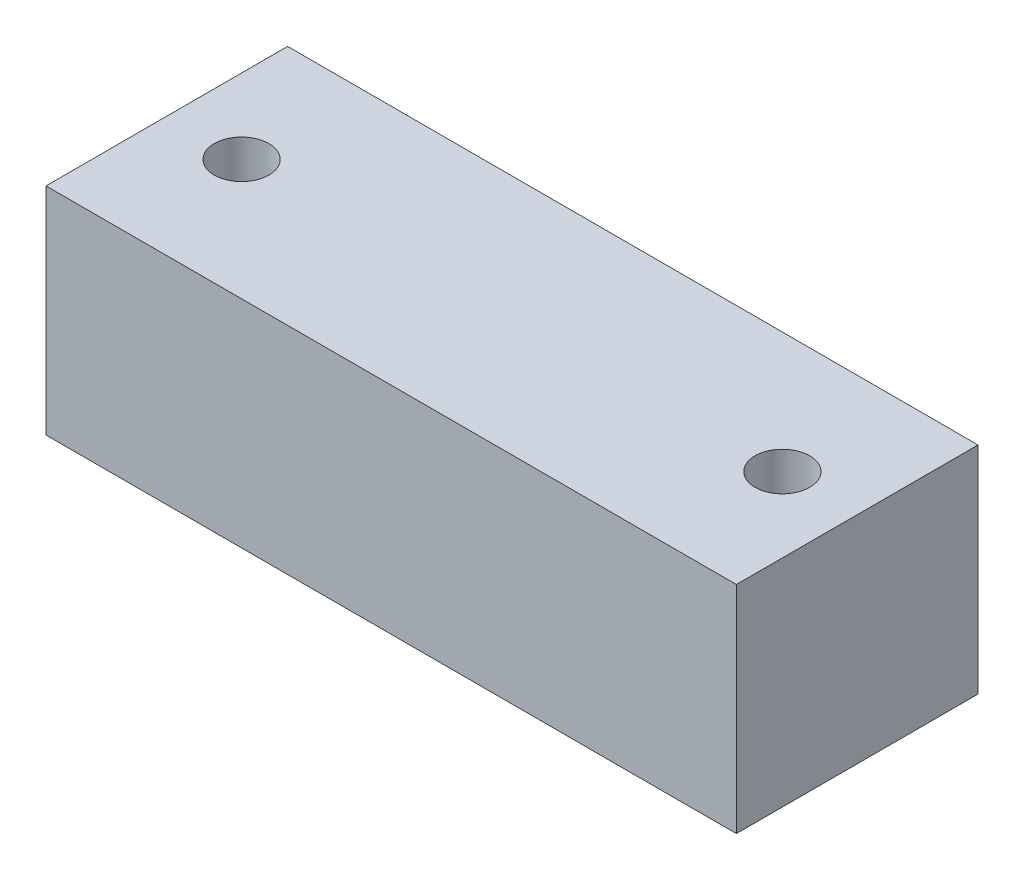
ISO-10303-21;
HEADER;
FILE_DESCRIPTION(('STEP AP214'),'2;1');
FILE_NAME('part.step','',(''),(''),'','','');
FILE_SCHEMA(('AUTOMOTIVE_DESIGN { 1 0 10303 214 1 1 1 1 }'));
ENDSEC;
DATA;
#1=APPLICATION_CONTEXT('core data for automotive mechanical design processes');
#2=APPLICATION_PROTOCOL_DEFINITION('international standard','automotive_design',2000,#1);
#3=PRODUCT_CONTEXT('',#1,'mechanical');
#4=PRODUCT('Part','Part','',(#3));
#5=PRODUCT_RELATED_PRODUCT_CATEGORY('part','',(#4));
#6=PRODUCT_DEFINITION_FORMATION('','',#4);
#7=PRODUCT_DEFINITION_CONTEXT('part definition',#1,'design');
#8=PRODUCT_DEFINITION('design','',#6,#7);
#9=PRODUCT_DEFINITION_SHAPE('','',#8);
#10=(LENGTH_UNIT() NAMED_UNIT(*) SI_UNIT(.MILLI.,.METRE.));
#11=(NAMED_UNIT(*) PLANE_ANGLE_UNIT() SI_UNIT($,.RADIAN.));
#12=(NAMED_UNIT(*) SI_UNIT($,.STERADIAN.) SOLID_ANGLE_UNIT());
#13=UNCERTAINTY_MEASURE_WITH_UNIT(LENGTH_MEASURE(1.E-05),#10,'distance_accuracy_value','');
#14=(GEOMETRIC_REPRESENTATION_CONTEXT(3) GLOBAL_UNCERTAINTY_ASSIGNED_CONTEXT((#13)) GLOBAL_UNIT_ASSIGNED_CONTEXT((#10,
#11,#12)) REPRESENTATION_CONTEXT('',''));
#15=CARTESIAN_POINT('',(0.,0.,0.));
#16=DIRECTION('',(0.,0.,1.));
#17=DIRECTION('',(1.,0.,0.));
#18=AXIS2_PLACEMENT_3D('',#15,#16,#17);
#19=CARTESIAN_POINT('',(0.,15.,0.));
#20=DIRECTION('',(0.,1.,0.));
#21=DIRECTION('',(0.,0.,1.));
#22=AXIS2_PLACEMENT_3D('',#19,#20,#21);
#23=PLANE('',#22);
#24=CARTESIAN_POINT('',(-18.8,15.,0.));
#25=DIRECTION('',(0.,1.,0.));
#26=DIRECTION('',(0.,0.,1.));
#27=AXIS2_PLACEMENT_3D('',#24,#25,#26);
#28=CIRCLE('',#27,1.9);
#29=CARTESIAN_POINT('',(-18.8,15.,1.9));
#30=VERTEX_POINT('',#29);
#31=EDGE_CURVE('E100',#30,#30,#28,.T.);
#32=ORIENTED_EDGE('',*,*,#31,.F.);
#33=EDGE_LOOP('',(#32));
#34=FACE_BOUND('',#33,.T.);
#35=DIRECTION('',(0.,0.,1.));
#36=VECTOR('',#35,1.);
#37=CARTESIAN_POINT('',(-24.,15.,8.40000000000001));
#38=LINE('',#37,#36);
#39=CARTESIAN_POINT('',(-24.,15.,-8.4));
#40=VERTEX_POINT('',#39);
#41=CARTESIAN_POINT('',(-24.,15.,8.40000000000001));
#42=VERTEX_POINT('',#41);
#43=EDGE_CURVE('E85',#40,#42,#38,.T.);
#44=ORIENTED_EDGE('',*,*,#43,.T.);
#45=DIRECTION('',(1.,0.,0.));
#46=VECTOR('',#45,1.);
#47=CARTESIAN_POINT('',(24.,15.,8.4));
#48=LINE('',#47,#46);
#49=CARTESIAN_POINT('',(24.,15.,8.4));
#50=VERTEX_POINT('',#49);
#51=EDGE_CURVE('E80',#42,#50,#48,.T.);
#52=ORIENTED_EDGE('',*,*,#51,.T.);
#53=DIRECTION('',(0.,0.,-1.));
#54=VECTOR('',#53,1.);
#55=CARTESIAN_POINT('',(24.,15.,8.4));
#56=LINE('',#55,#54);
#57=CARTESIAN_POINT('',(24.,15.,-8.4));
#58=VERTEX_POINT('',#57);
#59=EDGE_CURVE('E83',#50,#58,#56,.T.);
#60=ORIENTED_EDGE('',*,*,#59,.T.);
#61=DIRECTION('',(-1.,0.,0.));
#62=VECTOR('',#61,1.);
#63=CARTESIAN_POINT('',(24.,15.,-8.4));
#64=LINE('',#63,#62);
#65=EDGE_CURVE('E50',#58,#40,#64,.T.);
#66=ORIENTED_EDGE('',*,*,#65,.T.);
#67=EDGE_LOOP('',(#44,#52,#60,#66));
#68=FACE_BOUND('',#67,.T.);
#69=CARTESIAN_POINT('',(18.8,15.,0.));
#70=DIRECTION('',(0.,1.,0.));
#71=DIRECTION('',(0.,0.,1.));
#72=AXIS2_PLACEMENT_3D('',#69,#70,#71);
#73=CIRCLE('',#72,1.9);
#74=CARTESIAN_POINT('',(18.8,15.,1.9));
#75=VERTEX_POINT('',#74);
#76=EDGE_CURVE('E115',#75,#75,#73,.T.);
#77=ORIENTED_EDGE('',*,*,#76,.F.);
#78=EDGE_LOOP('',(#77));
#79=FACE_BOUND('',#78,.T.);
#80=ADVANCED_FACE('F33',(#34,#68,#79),#23,.T.);
#81=CARTESIAN_POINT('',(0.,0.,0.));
#82=DIRECTION('',(0.,1.,0.));
#83=DIRECTION('',(0.,0.,1.));
#84=AXIS2_PLACEMENT_3D('',#81,#82,#83);
#85=PLANE('',#84);
#86=CARTESIAN_POINT('',(-18.8,0.,0.));
#87=DIRECTION('',(0.,1.,0.));
#88=DIRECTION('',(0.,0.,1.));
#89=AXIS2_PLACEMENT_3D('',#86,#87,#88);
#90=CIRCLE('',#89,1.9);
#91=CARTESIAN_POINT('',(-18.8,0.,1.9));
#92=VERTEX_POINT('',#91);
#93=EDGE_CURVE('E112',#92,#92,#90,.T.);
#94=ORIENTED_EDGE('',*,*,#93,.T.);
#95=EDGE_LOOP('',(#94));
#96=FACE_BOUND('',#95,.T.);
#97=DIRECTION('',(0.,0.,1.));
#98=VECTOR('',#97,1.);
#99=CARTESIAN_POINT('',(-24.,0.,8.40000000000001));
#100=LINE('',#99,#98);
#101=CARTESIAN_POINT('',(-24.,0.,-8.4));
#102=VERTEX_POINT('',#101);
#103=CARTESIAN_POINT('',(-24.,0.,8.40000000000001));
#104=VERTEX_POINT('',#103);
#105=EDGE_CURVE('E97',#102,#104,#100,.T.);
#106=ORIENTED_EDGE('',*,*,#105,.F.);
#107=DIRECTION('',(-1.,0.,0.));
#108=VECTOR('',#107,1.);
#109=CARTESIAN_POINT('',(24.,0.,-8.4));
#110=LINE('',#109,#108);
#111=CARTESIAN_POINT('',(24.,0.,-8.4));
#112=VERTEX_POINT('',#111);
#113=EDGE_CURVE('E73',#112,#102,#110,.T.);
#114=ORIENTED_EDGE('',*,*,#113,.F.);
#115=DIRECTION('',(0.,0.,-1.));
#116=VECTOR('',#115,1.);
#117=CARTESIAN_POINT('',(24.,0.,8.4));
#118=LINE('',#117,#116);
#119=CARTESIAN_POINT('',(24.,0.,8.4));
#120=VERTEX_POINT('',#119);
#121=EDGE_CURVE('E67',#120,#112,#118,.T.);
#122=ORIENTED_EDGE('',*,*,#121,.F.);
#123=DIRECTION('',(1.,0.,0.));
#124=VECTOR('',#123,1.);
#125=CARTESIAN_POINT('',(24.,0.,8.4));
#126=LINE('',#125,#124);
#127=EDGE_CURVE('E89',#104,#120,#126,.T.);
#128=ORIENTED_EDGE('',*,*,#127,.F.);
#129=EDGE_LOOP('',(#106,#114,#122,#128));
#130=FACE_BOUND('',#129,.T.);
#131=CARTESIAN_POINT('',(18.8,0.,0.));
#132=DIRECTION('',(0.,1.,0.));
#133=DIRECTION('',(0.,0.,1.));
#134=AXIS2_PLACEMENT_3D('',#131,#132,#133);
#135=CIRCLE('',#134,1.9);
#136=CARTESIAN_POINT('',(18.8,0.,1.9));
#137=VERTEX_POINT('',#136);
#138=EDGE_CURVE('E118',#137,#137,#135,.T.);
#139=ORIENTED_EDGE('',*,*,#138,.T.);
#140=EDGE_LOOP('',(#139));
#141=FACE_BOUND('',#140,.T.);
#142=ADVANCED_FACE('F108',(#96,#130,#141),#85,.F.);
#143=CARTESIAN_POINT('',(-24.,15.,8.40000000000001));
#144=DIRECTION('',(1.,0.,0.));
#145=DIRECTION('',(0.,0.,-1.));
#146=AXIS2_PLACEMENT_3D('',#143,#144,#145);
#147=PLANE('',#146);
#148=ORIENTED_EDGE('',*,*,#105,.T.);
#149=DIRECTION('',(0.,-1.,0.));
#150=VECTOR('',#149,1.);
#151=CARTESIAN_POINT('',(-24.,15.,8.40000000000001));
#152=LINE('',#151,#150);
#153=EDGE_CURVE('E11',#42,#104,#152,.T.);
#154=ORIENTED_EDGE('',*,*,#153,.F.);
#155=ORIENTED_EDGE('',*,*,#43,.F.);
#156=DIRECTION('',(0.,-1.,0.));
#157=VECTOR('',#156,1.);
#158=CARTESIAN_POINT('',(-24.,15.,-8.4));
#159=LINE('',#158,#157);
#160=EDGE_CURVE('E93',#40,#102,#159,.T.);
#161=ORIENTED_EDGE('',*,*,#160,.T.);
#162=EDGE_LOOP('',(#148,#154,#155,#161));
#163=FACE_BOUND('',#162,.T.);
#164=ADVANCED_FACE('F35',(#163),#147,.F.);
#165=CARTESIAN_POINT('',(24.,15.,8.4));
#166=DIRECTION('',(0.,0.,-1.));
#167=DIRECTION('',(-1.,0.,0.));
#168=AXIS2_PLACEMENT_3D('',#165,#166,#167);
#169=PLANE('',#168);
#170=ORIENTED_EDGE('',*,*,#127,.T.);
#171=DIRECTION('',(0.,-1.,0.));
#172=VECTOR('',#171,1.);
#173=CARTESIAN_POINT('',(24.,15.,8.4));
#174=LINE('',#173,#172);
#175=EDGE_CURVE('E42',#50,#120,#174,.T.);
#176=ORIENTED_EDGE('',*,*,#175,.F.);
#177=ORIENTED_EDGE('',*,*,#51,.F.);
#178=ORIENTED_EDGE('',*,*,#153,.T.);
#179=EDGE_LOOP('',(#170,#176,#177,#178));
#180=FACE_BOUND('',#179,.T.);
#181=ADVANCED_FACE('F88',(#180),#169,.F.);
#182=CARTESIAN_POINT('',(24.,15.,8.4));
#183=DIRECTION('',(-1.,0.,0.));
#184=DIRECTION('',(0.,0.,1.));
#185=AXIS2_PLACEMENT_3D('',#182,#183,#184);
#186=PLANE('',#185);
#187=ORIENTED_EDGE('',*,*,#121,.T.);
#188=DIRECTION('',(0.,-1.,0.));
#189=VECTOR('',#188,1.);
#190=CARTESIAN_POINT('',(24.,15.,-8.4));
#191=LINE('',#190,#189);
#192=EDGE_CURVE('E90',#58,#112,#191,.T.);
#193=ORIENTED_EDGE('',*,*,#192,.F.);
#194=ORIENTED_EDGE('',*,*,#59,.F.);
#195=ORIENTED_EDGE('',*,*,#175,.T.);
#196=EDGE_LOOP('',(#187,#193,#194,#195));
#197=FACE_BOUND('',#196,.T.);
#198=ADVANCED_FACE('F91',(#197),#186,.F.);
#199=CARTESIAN_POINT('',(24.,15.,-8.4));
#200=DIRECTION('',(0.,0.,1.));
#201=DIRECTION('',(1.,0.,0.));
#202=AXIS2_PLACEMENT_3D('',#199,#200,#201);
#203=PLANE('',#202);
#204=ORIENTED_EDGE('',*,*,#113,.T.);
#205=ORIENTED_EDGE('',*,*,#160,.F.);
#206=ORIENTED_EDGE('',*,*,#65,.F.);
#207=ORIENTED_EDGE('',*,*,#192,.T.);
#208=EDGE_LOOP('',(#204,#205,#206,#207));
#209=FACE_BOUND('',#208,.T.);
#210=ADVANCED_FACE('F105',(#209),#203,.F.);
#211=CARTESIAN_POINT('',(-18.8,15.,0.));
#212=DIRECTION('',(0.,-1.,0.));
#213=DIRECTION('',(0.,0.,-1.));
#214=AXIS2_PLACEMENT_3D('',#211,#212,#213);
#215=CYLINDRICAL_SURFACE('',#214,1.9);
#216=ORIENTED_EDGE('',*,*,#31,.T.);
#217=EDGE_LOOP('',(#216));
#218=FACE_BOUND('',#217,.T.);
#219=ORIENTED_EDGE('',*,*,#93,.F.);
#220=EDGE_LOOP('',(#219));
#221=FACE_BOUND('',#220,.T.);
#222=ADVANCED_FACE('F136',(#218,#221),#215,.F.);
#223=CARTESIAN_POINT('',(18.8,15.,0.));
#224=DIRECTION('',(0.,-1.,0.));
#225=DIRECTION('',(0.,0.,-1.));
#226=AXIS2_PLACEMENT_3D('',#223,#224,#225);
#227=CYLINDRICAL_SURFACE('',#226,1.9);
#228=ORIENTED_EDGE('',*,*,#76,.T.);
#229=EDGE_LOOP('',(#228));
#230=FACE_BOUND('',#229,.T.);
#231=ORIENTED_EDGE('',*,*,#138,.F.);
#232=EDGE_LOOP('',(#231));
#233=FACE_BOUND('',#232,.T.);
#234=ADVANCED_FACE('F124',(#230,#233),#227,.F.);
#235=CLOSED_SHELL('',(#80,#142,#164,#181,#198,#210,#222,#234));
#236=MANIFOLD_SOLID_BREP('B2',#235);
#237=ADVANCED_BREP_SHAPE_REPRESENTATION('',(#18,#236),#14);
#238=SHAPE_DEFINITION_REPRESENTATION(#9,#237);
ENDSEC;
END-ISO-10303-21;
